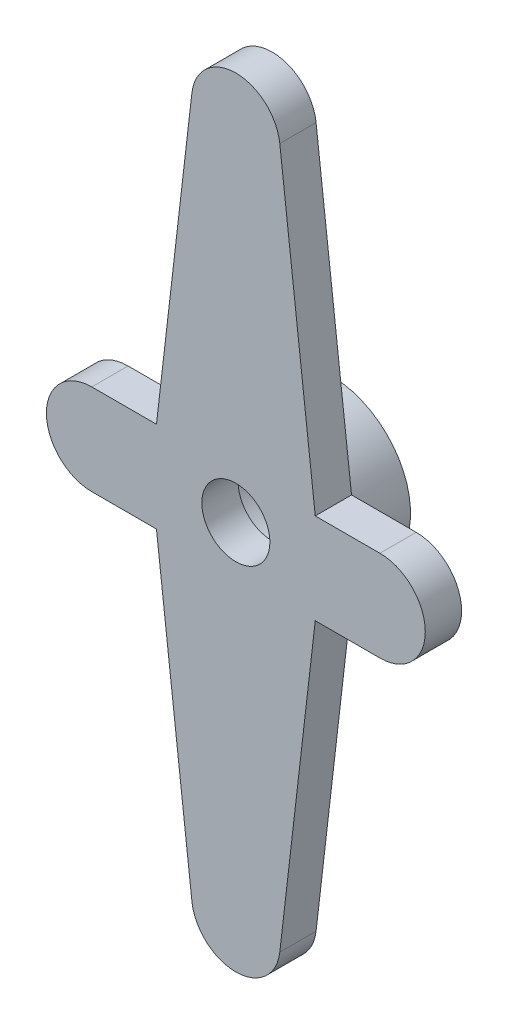
ISO-10303-21;
HEADER;
FILE_DESCRIPTION(('STEP AP214'),'2;1');
FILE_NAME('part.step','',(''),(''),'','','');
FILE_SCHEMA(('AUTOMOTIVE_DESIGN { 1 0 10303 214 1 1 1 1 }'));
ENDSEC;
DATA;
#1=APPLICATION_CONTEXT('core data for automotive mechanical design processes');
#2=APPLICATION_PROTOCOL_DEFINITION('international standard','automotive_design',2000,#1);
#3=PRODUCT_CONTEXT('',#1,'mechanical');
#4=PRODUCT('Part','Part','',(#3));
#5=PRODUCT_RELATED_PRODUCT_CATEGORY('part','',(#4));
#6=PRODUCT_DEFINITION_FORMATION('','',#4);
#7=PRODUCT_DEFINITION_CONTEXT('part definition',#1,'design');
#8=PRODUCT_DEFINITION('design','',#6,#7);
#9=PRODUCT_DEFINITION_SHAPE('','',#8);
#10=(LENGTH_UNIT() NAMED_UNIT(*) SI_UNIT(.MILLI.,.METRE.));
#11=(NAMED_UNIT(*) PLANE_ANGLE_UNIT() SI_UNIT($,.RADIAN.));
#12=(NAMED_UNIT(*) SI_UNIT($,.STERADIAN.) SOLID_ANGLE_UNIT());
#13=UNCERTAINTY_MEASURE_WITH_UNIT(LENGTH_MEASURE(1.E-05),#10,'distance_accuracy_value','');
#14=(GEOMETRIC_REPRESENTATION_CONTEXT(3) GLOBAL_UNCERTAINTY_ASSIGNED_CONTEXT((#13)) GLOBAL_UNIT_ASSIGNED_CONTEXT((#10,
#11,#12)) REPRESENTATION_CONTEXT('',''));
#15=CARTESIAN_POINT('',(0.,0.,0.));
#16=DIRECTION('',(0.,0.,1.));
#17=DIRECTION('',(1.,0.,0.));
#18=AXIS2_PLACEMENT_3D('',#15,#16,#17);
#19=CARTESIAN_POINT('',(-6.349999999074,5.05012435482173,1.6));
#20=DIRECTION('',(0.,0.,-1.));
#21=DIRECTION('',(-1.,0.,0.));
#22=AXIS2_PLACEMENT_3D('',#19,#20,#21);
#23=CYLINDRICAL_SURFACE('',#22,2.);
#24=CARTESIAN_POINT('',(-6.349999999074,5.05012435482173,0.));
#25=DIRECTION('',(0.,0.,1.));
#26=DIRECTION('',(1.,0.,0.));
#27=AXIS2_PLACEMENT_3D('',#24,#25,#26);
#28=CIRCLE('',#27,2.);
#29=CARTESIAN_POINT('',(-6.349999999074,7.05012435482173,0.));
#30=VERTEX_POINT('',#29);
#31=CARTESIAN_POINT('',(-6.349999999074,3.05012435482173,0.));
#32=VERTEX_POINT('',#31);
#33=EDGE_CURVE('E161',#30,#32,#28,.T.);
#34=ORIENTED_EDGE('',*,*,#33,.T.);
#35=DIRECTION('',(0.,0.,-1.));
#36=VECTOR('',#35,1.);
#37=CARTESIAN_POINT('',(-6.349999999074,3.05012435482173,1.6));
#38=LINE('',#37,#36);
#39=CARTESIAN_POINT('',(-6.349999999074,3.05012435482173,1.6));
#40=VERTEX_POINT('',#39);
#41=EDGE_CURVE('E47',#40,#32,#38,.T.);
#42=ORIENTED_EDGE('',*,*,#41,.F.);
#43=CARTESIAN_POINT('',(-6.349999999074,5.05012435482173,1.6));
#44=DIRECTION('',(0.,0.,1.));
#45=DIRECTION('',(1.,0.,0.));
#46=AXIS2_PLACEMENT_3D('',#43,#44,#45);
#47=CIRCLE('',#46,2.);
#48=CARTESIAN_POINT('',(-6.349999999074,7.05012435482173,1.6));
#49=VERTEX_POINT('',#48);
#50=EDGE_CURVE('E184',#49,#40,#47,.T.);
#51=ORIENTED_EDGE('',*,*,#50,.F.);
#52=DIRECTION('',(0.,0.,-1.));
#53=VECTOR('',#52,1.);
#54=CARTESIAN_POINT('',(-6.349999999074,7.05012435482173,1.6));
#55=LINE('',#54,#53);
#56=EDGE_CURVE('E157',#49,#30,#55,.T.);
#57=ORIENTED_EDGE('',*,*,#56,.T.);
#58=EDGE_LOOP('',(#34,#42,#51,#57));
#59=FACE_BOUND('',#58,.T.);
#60=ADVANCED_FACE('F38',(#59),#23,.T.);
#61=CARTESIAN_POINT('',(-6.349999999074,3.05012435482173,1.6));
#62=DIRECTION('',(0.,1.,0.));
#63=DIRECTION('',(-1.,0.,0.));
#64=AXIS2_PLACEMENT_3D('',#61,#62,#63);
#65=PLANE('',#64);
#66=DIRECTION('',(1.,0.,0.));
#67=VECTOR('',#66,1.);
#68=CARTESIAN_POINT('',(-6.349999999074,3.05012435482173,0.));
#69=LINE('',#68,#67);
#70=CARTESIAN_POINT('',(-3.5,3.05012435482173,0.));
#71=VERTEX_POINT('',#70);
#72=EDGE_CURVE('E164',#32,#71,#69,.T.);
#73=ORIENTED_EDGE('',*,*,#72,.T.);
#74=DIRECTION('',(0.,0.,-1.));
#75=VECTOR('',#74,1.);
#76=CARTESIAN_POINT('',(-3.5,3.05012435482173,1.6));
#77=LINE('',#76,#75);
#78=CARTESIAN_POINT('',(-3.5,3.05012435482173,1.6));
#79=VERTEX_POINT('',#78);
#80=EDGE_CURVE('E206',#79,#71,#77,.T.);
#81=ORIENTED_EDGE('',*,*,#80,.F.);
#82=DIRECTION('',(1.,0.,0.));
#83=VECTOR('',#82,1.);
#84=CARTESIAN_POINT('',(-6.349999999074,3.05012435482173,1.6));
#85=LINE('',#84,#83);
#86=EDGE_CURVE('E112',#40,#79,#85,.T.);
#87=ORIENTED_EDGE('',*,*,#86,.F.);
#88=ORIENTED_EDGE('',*,*,#41,.T.);
#89=EDGE_LOOP('',(#73,#81,#87,#88));
#90=FACE_BOUND('',#89,.T.);
#91=ADVANCED_FACE('F209',(#90),#65,.F.);
#92=CARTESIAN_POINT('',(-3.5,3.05012435482173,1.6));
#93=DIRECTION('',(0.993300343280583,0.115561360491629,0.));
#94=DIRECTION('',(-0.115561360491629,0.993300343280583,0.));
#95=AXIS2_PLACEMENT_3D('',#92,#93,#94);
#96=PLANE('',#95);
#97=DIRECTION('',(0.115561360491629,-0.993300343280583,0.));
#98=VECTOR('',#97,1.);
#99=CARTESIAN_POINT('',(-3.5,3.05012435482173,0.));
#100=LINE('',#99,#98);
#101=CARTESIAN_POINT('',(-1.93693566939714,-10.3850959433152,0.));
#102=VERTEX_POINT('',#101);
#103=EDGE_CURVE('E167',#71,#102,#100,.T.);
#104=ORIENTED_EDGE('',*,*,#103,.T.);
#105=DIRECTION('',(0.,0.,-1.));
#106=VECTOR('',#105,1.);
#107=CARTESIAN_POINT('',(-1.93693566939714,-10.3850959433152,1.6));
#108=LINE('',#107,#106);
#109=CARTESIAN_POINT('',(-1.93693566939714,-10.3850959433152,1.6));
#110=VERTEX_POINT('',#109);
#111=EDGE_CURVE('E203',#110,#102,#108,.T.);
#112=ORIENTED_EDGE('',*,*,#111,.F.);
#113=DIRECTION('',(0.115561360491629,-0.993300343280583,0.));
#114=VECTOR('',#113,1.);
#115=CARTESIAN_POINT('',(-3.5,3.05012435482173,1.6));
#116=LINE('',#115,#114);
#117=EDGE_CURVE('E229',#79,#110,#116,.T.);
#118=ORIENTED_EDGE('',*,*,#117,.F.);
#119=ORIENTED_EDGE('',*,*,#80,.T.);
#120=EDGE_LOOP('',(#104,#112,#118,#119));
#121=FACE_BOUND('',#120,.T.);
#122=ADVANCED_FACE('F220',(#121),#96,.F.);
#123=CARTESIAN_POINT('',(0.,-10.1597512903565,1.6));
#124=DIRECTION('',(0.,0.,-1.));
#125=DIRECTION('',(-1.,0.,0.));
#126=AXIS2_PLACEMENT_3D('',#123,#124,#125);
#127=CYLINDRICAL_SURFACE('',#126,1.95);
#128=CARTESIAN_POINT('',(0.,-10.1597512903565,0.));
#129=DIRECTION('',(0.,0.,1.));
#130=DIRECTION('',(-1.,0.,0.));
#131=AXIS2_PLACEMENT_3D('',#128,#129,#130);
#132=CIRCLE('',#131,1.95);
#133=CARTESIAN_POINT('',(1.93693566939714,-10.3850959433152,0.));
#134=VERTEX_POINT('',#133);
#135=EDGE_CURVE('E169',#102,#134,#132,.T.);
#136=ORIENTED_EDGE('',*,*,#135,.T.);
#137=DIRECTION('',(0.,0.,-1.));
#138=VECTOR('',#137,1.);
#139=CARTESIAN_POINT('',(1.93693566939714,-10.3850959433152,1.6));
#140=LINE('',#139,#138);
#141=CARTESIAN_POINT('',(1.93693566939714,-10.3850959433152,1.6));
#142=VERTEX_POINT('',#141);
#143=EDGE_CURVE('E200',#142,#134,#140,.T.);
#144=ORIENTED_EDGE('',*,*,#143,.F.);
#145=CARTESIAN_POINT('',(0.,-10.1597512903565,1.6));
#146=DIRECTION('',(0.,0.,1.));
#147=DIRECTION('',(-1.,0.,0.));
#148=AXIS2_PLACEMENT_3D('',#145,#146,#147);
#149=CIRCLE('',#148,1.95);
#150=EDGE_CURVE('E226',#110,#142,#149,.T.);
#151=ORIENTED_EDGE('',*,*,#150,.F.);
#152=ORIENTED_EDGE('',*,*,#111,.T.);
#153=EDGE_LOOP('',(#136,#144,#151,#152));
#154=FACE_BOUND('',#153,.T.);
#155=ADVANCED_FACE('F224',(#154),#127,.T.);
#156=CARTESIAN_POINT('',(3.5,3.05012435482173,1.6));
#157=DIRECTION('',(-0.993300343280583,0.115561360491629,0.));
#158=DIRECTION('',(-0.115561360491629,-0.993300343280583,0.));
#159=AXIS2_PLACEMENT_3D('',#156,#157,#158);
#160=PLANE('',#159);
#161=DIRECTION('',(0.115561360491629,0.993300343280583,0.));
#162=VECTOR('',#161,1.);
#163=CARTESIAN_POINT('',(3.5,3.05012435482173,0.));
#164=LINE('',#163,#162);
#165=CARTESIAN_POINT('',(3.5,3.05012435482173,0.));
#166=VERTEX_POINT('',#165);
#167=EDGE_CURVE('E171',#134,#166,#164,.T.);
#168=ORIENTED_EDGE('',*,*,#167,.T.);
#169=DIRECTION('',(0.,0.,-1.));
#170=VECTOR('',#169,1.);
#171=CARTESIAN_POINT('',(3.5,3.05012435482173,1.6));
#172=LINE('',#171,#170);
#173=CARTESIAN_POINT('',(3.5,3.05012435482173,1.6));
#174=VERTEX_POINT('',#173);
#175=EDGE_CURVE('E197',#174,#166,#172,.T.);
#176=ORIENTED_EDGE('',*,*,#175,.F.);
#177=DIRECTION('',(0.115561360491629,0.993300343280583,0.));
#178=VECTOR('',#177,1.);
#179=CARTESIAN_POINT('',(3.5,3.05012435482173,1.6));
#180=LINE('',#179,#178);
#181=EDGE_CURVE('E228',#142,#174,#180,.T.);
#182=ORIENTED_EDGE('',*,*,#181,.F.);
#183=ORIENTED_EDGE('',*,*,#143,.T.);
#184=EDGE_LOOP('',(#168,#176,#182,#183));
#185=FACE_BOUND('',#184,.T.);
#186=ADVANCED_FACE('F260',(#185),#160,.F.);
#187=CARTESIAN_POINT('',(6.349999999074,3.05012435482173,1.6));
#188=DIRECTION('',(0.,1.,0.));
#189=DIRECTION('',(-1.,0.,0.));
#190=AXIS2_PLACEMENT_3D('',#187,#188,#189);
#191=PLANE('',#190);
#192=DIRECTION('',(1.,0.,0.));
#193=VECTOR('',#192,1.);
#194=CARTESIAN_POINT('',(6.349999999074,3.05012435482173,0.));
#195=LINE('',#194,#193);
#196=CARTESIAN_POINT('',(6.349999999074,3.05012435482173,0.));
#197=VERTEX_POINT('',#196);
#198=EDGE_CURVE('E173',#166,#197,#195,.T.);
#199=ORIENTED_EDGE('',*,*,#198,.T.);
#200=DIRECTION('',(0.,0.,-1.));
#201=VECTOR('',#200,1.);
#202=CARTESIAN_POINT('',(6.349999999074,3.05012435482173,1.6));
#203=LINE('',#202,#201);
#204=CARTESIAN_POINT('',(6.349999999074,3.05012435482173,1.6));
#205=VERTEX_POINT('',#204);
#206=EDGE_CURVE('E194',#205,#197,#203,.T.);
#207=ORIENTED_EDGE('',*,*,#206,.F.);
#208=DIRECTION('',(1.,0.,0.));
#209=VECTOR('',#208,1.);
#210=CARTESIAN_POINT('',(6.349999999074,3.05012435482173,1.6));
#211=LINE('',#210,#209);
#212=EDGE_CURVE('E231',#174,#205,#211,.T.);
#213=ORIENTED_EDGE('',*,*,#212,.F.);
#214=ORIENTED_EDGE('',*,*,#175,.T.);
#215=EDGE_LOOP('',(#199,#207,#213,#214));
#216=FACE_BOUND('',#215,.T.);
#217=ADVANCED_FACE('F257',(#216),#191,.F.);
#218=CARTESIAN_POINT('',(6.349999999074,5.05012435482173,1.6));
#219=DIRECTION('',(0.,0.,-1.));
#220=DIRECTION('',(-1.,0.,0.));
#221=AXIS2_PLACEMENT_3D('',#218,#219,#220);
#222=CYLINDRICAL_SURFACE('',#221,2.);
#223=CARTESIAN_POINT('',(6.349999999074,5.05012435482173,0.));
#224=DIRECTION('',(0.,0.,1.));
#225=DIRECTION('',(-1.,0.,0.));
#226=AXIS2_PLACEMENT_3D('',#223,#224,#225);
#227=CIRCLE('',#226,2.);
#228=CARTESIAN_POINT('',(6.349999999074,7.05012435482173,0.));
#229=VERTEX_POINT('',#228);
#230=EDGE_CURVE('E175',#197,#229,#227,.T.);
#231=ORIENTED_EDGE('',*,*,#230,.T.);
#232=DIRECTION('',(0.,0.,-1.));
#233=VECTOR('',#232,1.);
#234=CARTESIAN_POINT('',(6.349999999074,7.05012435482173,1.6));
#235=LINE('',#234,#233);
#236=CARTESIAN_POINT('',(6.349999999074,7.05012435482173,1.6));
#237=VERTEX_POINT('',#236);
#238=EDGE_CURVE('E191',#237,#229,#235,.T.);
#239=ORIENTED_EDGE('',*,*,#238,.F.);
#240=CARTESIAN_POINT('',(6.349999999074,5.05012435482173,1.6));
#241=DIRECTION('',(0.,0.,1.));
#242=DIRECTION('',(-1.,0.,0.));
#243=AXIS2_PLACEMENT_3D('',#240,#241,#242);
#244=CIRCLE('',#243,2.);
#245=EDGE_CURVE('E237',#205,#237,#244,.T.);
#246=ORIENTED_EDGE('',*,*,#245,.F.);
#247=ORIENTED_EDGE('',*,*,#206,.T.);
#248=EDGE_LOOP('',(#231,#239,#246,#247));
#249=FACE_BOUND('',#248,.T.);
#250=ADVANCED_FACE('F253',(#249),#222,.T.);
#251=CARTESIAN_POINT('',(6.349999999074,7.05012435482173,1.6));
#252=DIRECTION('',(0.,-1.,0.));
#253=DIRECTION('',(1.,0.,0.));
#254=AXIS2_PLACEMENT_3D('',#251,#252,#253);
#255=PLANE('',#254);
#256=DIRECTION('',(-1.,0.,0.));
#257=VECTOR('',#256,1.);
#258=CARTESIAN_POINT('',(6.349999999074,7.05012435482173,0.));
#259=LINE('',#258,#257);
#260=CARTESIAN_POINT('',(3.5,7.05012435482173,0.));
#261=VERTEX_POINT('',#260);
#262=EDGE_CURVE('E177',#229,#261,#259,.T.);
#263=ORIENTED_EDGE('',*,*,#262,.T.);
#264=DIRECTION('',(0.,0.,-1.));
#265=VECTOR('',#264,1.);
#266=CARTESIAN_POINT('',(3.5,7.05012435482173,1.6));
#267=LINE('',#266,#265);
#268=CARTESIAN_POINT('',(3.5,7.05012435482173,1.6));
#269=VERTEX_POINT('',#268);
#270=EDGE_CURVE('E188',#269,#261,#267,.T.);
#271=ORIENTED_EDGE('',*,*,#270,.F.);
#272=DIRECTION('',(-1.,0.,0.));
#273=VECTOR('',#272,1.);
#274=CARTESIAN_POINT('',(6.349999999074,7.05012435482173,1.6));
#275=LINE('',#274,#273);
#276=EDGE_CURVE('E239',#237,#269,#275,.T.);
#277=ORIENTED_EDGE('',*,*,#276,.F.);
#278=ORIENTED_EDGE('',*,*,#238,.T.);
#279=EDGE_LOOP('',(#263,#271,#277,#278));
#280=FACE_BOUND('',#279,.T.);
#281=ADVANCED_FACE('F245',(#280),#255,.F.);
#282=CARTESIAN_POINT('',(3.5,7.05012435482173,1.6));
#283=DIRECTION('',(-0.993300343280583,-0.115561360491629,0.));
#284=DIRECTION('',(0.115561360491629,-0.993300343280583,0.));
#285=AXIS2_PLACEMENT_3D('',#282,#283,#284);
#286=PLANE('',#285);
#287=DIRECTION('',(-0.115561360491629,0.993300343280583,0.));
#288=VECTOR('',#287,1.);
#289=CARTESIAN_POINT('',(3.5,7.05012435482173,0.));
#290=LINE('',#289,#288);
#291=CARTESIAN_POINT('',(1.93693566939714,20.4853446529587,0.));
#292=VERTEX_POINT('',#291);
#293=EDGE_CURVE('E179',#261,#292,#290,.T.);
#294=ORIENTED_EDGE('',*,*,#293,.T.);
#295=DIRECTION('',(0.,0.,-1.));
#296=VECTOR('',#295,1.);
#297=CARTESIAN_POINT('',(1.93693566939714,20.4853446529587,1.6));
#298=LINE('',#297,#296);
#299=CARTESIAN_POINT('',(1.93693566939714,20.4853446529587,1.6));
#300=VERTEX_POINT('',#299);
#301=EDGE_CURVE('E152',#300,#292,#298,.T.);
#302=ORIENTED_EDGE('',*,*,#301,.F.);
#303=DIRECTION('',(-0.115561360491629,0.993300343280583,0.));
#304=VECTOR('',#303,1.);
#305=CARTESIAN_POINT('',(3.5,7.05012435482173,1.6));
#306=LINE('',#305,#304);
#307=EDGE_CURVE('E143',#269,#300,#306,.T.);
#308=ORIENTED_EDGE('',*,*,#307,.F.);
#309=ORIENTED_EDGE('',*,*,#270,.T.);
#310=EDGE_LOOP('',(#294,#302,#308,#309));
#311=FACE_BOUND('',#310,.T.);
#312=ADVANCED_FACE('F249',(#311),#286,.F.);
#313=CARTESIAN_POINT('',(0.,20.26,1.6));
#314=DIRECTION('',(0.,0.,-1.));
#315=DIRECTION('',(-1.,0.,0.));
#316=AXIS2_PLACEMENT_3D('',#313,#314,#315);
#317=CYLINDRICAL_SURFACE('',#316,1.95);
#318=CARTESIAN_POINT('',(0.,20.26,0.));
#319=DIRECTION('',(0.,0.,1.));
#320=DIRECTION('',(1.,0.,0.));
#321=AXIS2_PLACEMENT_3D('',#318,#319,#320);
#322=CIRCLE('',#321,1.95);
#323=CARTESIAN_POINT('',(-1.93693566939714,20.4853446529587,0.));
#324=VERTEX_POINT('',#323);
#325=EDGE_CURVE('E151',#292,#324,#322,.T.);
#326=ORIENTED_EDGE('',*,*,#325,.T.);
#327=DIRECTION('',(0.,0.,-1.));
#328=VECTOR('',#327,1.);
#329=CARTESIAN_POINT('',(-1.93693566939714,20.4853446529587,1.6));
#330=LINE('',#329,#328);
#331=CARTESIAN_POINT('',(-1.93693566939714,20.4853446529587,1.6));
#332=VERTEX_POINT('',#331);
#333=EDGE_CURVE('E148',#332,#324,#330,.T.);
#334=ORIENTED_EDGE('',*,*,#333,.F.);
#335=CARTESIAN_POINT('',(0.,20.26,1.6));
#336=DIRECTION('',(0.,0.,1.));
#337=DIRECTION('',(1.,0.,0.));
#338=AXIS2_PLACEMENT_3D('',#335,#336,#337);
#339=CIRCLE('',#338,1.95);
#340=EDGE_CURVE('E137',#300,#332,#339,.T.);
#341=ORIENTED_EDGE('',*,*,#340,.F.);
#342=ORIENTED_EDGE('',*,*,#301,.T.);
#343=EDGE_LOOP('',(#326,#334,#341,#342));
#344=FACE_BOUND('',#343,.T.);
#345=ADVANCED_FACE('F149',(#344),#317,.T.);
#346=CARTESIAN_POINT('',(-3.5,7.05012435482173,1.6));
#347=DIRECTION('',(0.993300343280583,-0.115561360491629,0.));
#348=DIRECTION('',(0.115561360491629,0.993300343280583,0.));
#349=AXIS2_PLACEMENT_3D('',#346,#347,#348);
#350=PLANE('',#349);
#351=DIRECTION('',(-0.115561360491629,-0.993300343280583,0.));
#352=VECTOR('',#351,1.);
#353=CARTESIAN_POINT('',(-3.5,7.05012435482173,0.));
#354=LINE('',#353,#352);
#355=CARTESIAN_POINT('',(-3.5,7.05012435482173,0.));
#356=VERTEX_POINT('',#355);
#357=EDGE_CURVE('E97',#324,#356,#354,.T.);
#358=ORIENTED_EDGE('',*,*,#357,.T.);
#359=DIRECTION('',(0.,0.,-1.));
#360=VECTOR('',#359,1.);
#361=CARTESIAN_POINT('',(-3.5,7.05012435482173,1.6));
#362=LINE('',#361,#360);
#363=CARTESIAN_POINT('',(-3.5,7.05012435482173,1.6));
#364=VERTEX_POINT('',#363);
#365=EDGE_CURVE('E153',#364,#356,#362,.T.);
#366=ORIENTED_EDGE('',*,*,#365,.F.);
#367=DIRECTION('',(-0.115561360491629,-0.993300343280583,0.));
#368=VECTOR('',#367,1.);
#369=CARTESIAN_POINT('',(-3.5,7.05012435482173,1.6));
#370=LINE('',#369,#368);
#371=EDGE_CURVE('E141',#332,#364,#370,.T.);
#372=ORIENTED_EDGE('',*,*,#371,.F.);
#373=ORIENTED_EDGE('',*,*,#333,.T.);
#374=EDGE_LOOP('',(#358,#366,#372,#373));
#375=FACE_BOUND('',#374,.T.);
#376=ADVANCED_FACE('F155',(#375),#350,.F.);
#377=CARTESIAN_POINT('',(-6.349999999074,7.05012435482173,1.6));
#378=DIRECTION('',(0.,-1.,0.));
#379=DIRECTION('',(1.,0.,0.));
#380=AXIS2_PLACEMENT_3D('',#377,#378,#379);
#381=PLANE('',#380);
#382=DIRECTION('',(-1.,0.,0.));
#383=VECTOR('',#382,1.);
#384=CARTESIAN_POINT('',(-6.349999999074,7.05012435482173,0.));
#385=LINE('',#384,#383);
#386=EDGE_CURVE('E103',#356,#30,#385,.T.);
#387=ORIENTED_EDGE('',*,*,#386,.T.);
#388=ORIENTED_EDGE('',*,*,#56,.F.);
#389=DIRECTION('',(-1.,0.,0.));
#390=VECTOR('',#389,1.);
#391=CARTESIAN_POINT('',(-6.349999999074,7.05012435482173,1.6));
#392=LINE('',#391,#390);
#393=EDGE_CURVE('E56',#364,#49,#392,.T.);
#394=ORIENTED_EDGE('',*,*,#393,.F.);
#395=ORIENTED_EDGE('',*,*,#365,.T.);
#396=EDGE_LOOP('',(#387,#388,#394,#395));
#397=FACE_BOUND('',#396,.T.);
#398=ADVANCED_FACE('F334',(#397),#381,.F.);
#399=CARTESIAN_POINT('',(-6.349999999074,5.05012435482173,1.6));
#400=DIRECTION('',(0.,0.,1.));
#401=DIRECTION('',(1.,0.,0.));
#402=AXIS2_PLACEMENT_3D('',#399,#400,#401);
#403=PLANE('',#402);
#404=CARTESIAN_POINT('',(0.,5.04999999999999,1.6));
#405=DIRECTION('',(0.,0.,1.));
#406=DIRECTION('',(1.,0.,0.));
#407=AXIS2_PLACEMENT_3D('',#404,#405,#406);
#408=CIRCLE('',#407,1.5);
#409=CARTESIAN_POINT('',(1.5,5.04999999999999,1.6));
#410=VERTEX_POINT('',#409);
#411=EDGE_CURVE('E41',#410,#410,#408,.T.);
#412=ORIENTED_EDGE('',*,*,#411,.F.);
#413=EDGE_LOOP('',(#412));
#414=FACE_BOUND('',#413,.T.);
#415=ORIENTED_EDGE('',*,*,#50,.T.);
#416=ORIENTED_EDGE('',*,*,#86,.T.);
#417=ORIENTED_EDGE('',*,*,#117,.T.);
#418=ORIENTED_EDGE('',*,*,#150,.T.);
#419=ORIENTED_EDGE('',*,*,#181,.T.);
#420=ORIENTED_EDGE('',*,*,#212,.T.);
#421=ORIENTED_EDGE('',*,*,#245,.T.);
#422=ORIENTED_EDGE('',*,*,#276,.T.);
#423=ORIENTED_EDGE('',*,*,#307,.T.);
#424=ORIENTED_EDGE('',*,*,#340,.T.);
#425=ORIENTED_EDGE('',*,*,#371,.T.);
#426=ORIENTED_EDGE('',*,*,#393,.T.);
#427=EDGE_LOOP('',(#415,#416,#417,#418,#419,#420,#421,#422,#423,#424,#425,#426));
#428=FACE_BOUND('',#427,.T.);
#429=ADVANCED_FACE('F139',(#414,#428),#403,.T.);
#430=CARTESIAN_POINT('',(-6.349999999074,5.05012435482173,0.));
#431=DIRECTION('',(0.,0.,1.));
#432=DIRECTION('',(1.,0.,0.));
#433=AXIS2_PLACEMENT_3D('',#430,#431,#432);
#434=PLANE('',#433);
#435=CARTESIAN_POINT('',(0.,5.04999999999999,0.));
#436=DIRECTION('',(0.,0.,-1.));
#437=DIRECTION('',(-1.,0.,0.));
#438=AXIS2_PLACEMENT_3D('',#435,#436,#437);
#439=CIRCLE('',#438,3.5);
#440=CARTESIAN_POINT('',(-3.5,5.04999999999999,0.));
#441=VERTEX_POINT('',#440);
#442=EDGE_CURVE('E11',#441,#441,#439,.T.);
#443=ORIENTED_EDGE('',*,*,#442,.F.);
#444=EDGE_LOOP('',(#443));
#445=FACE_BOUND('',#444,.T.);
#446=ORIENTED_EDGE('',*,*,#33,.F.);
#447=ORIENTED_EDGE('',*,*,#386,.F.);
#448=ORIENTED_EDGE('',*,*,#357,.F.);
#449=ORIENTED_EDGE('',*,*,#325,.F.);
#450=ORIENTED_EDGE('',*,*,#293,.F.);
#451=ORIENTED_EDGE('',*,*,#262,.F.);
#452=ORIENTED_EDGE('',*,*,#230,.F.);
#453=ORIENTED_EDGE('',*,*,#198,.F.);
#454=ORIENTED_EDGE('',*,*,#167,.F.);
#455=ORIENTED_EDGE('',*,*,#135,.F.);
#456=ORIENTED_EDGE('',*,*,#103,.F.);
#457=ORIENTED_EDGE('',*,*,#72,.F.);
#458=EDGE_LOOP('',(#446,#447,#448,#449,#450,#451,#452,#453,#454,#455,#456,#457));
#459=FACE_BOUND('',#458,.T.);
#460=ADVANCED_FACE('F214',(#445,#459),#434,.F.);
#461=CARTESIAN_POINT('',(0.,5.04999999999999,-2.6));
#462=DIRECTION('',(0.,0.,-1.));
#463=DIRECTION('',(-1.,0.,0.));
#464=AXIS2_PLACEMENT_3D('',#461,#462,#463);
#465=PLANE('',#464);
#466=CARTESIAN_POINT('',(0.,5.04999999999999,-2.6));
#467=DIRECTION('',(0.,0.,-1.));
#468=DIRECTION('',(-1.,0.,0.));
#469=AXIS2_PLACEMENT_3D('',#466,#467,#468);
#470=CIRCLE('',#469,3.5);
#471=CARTESIAN_POINT('',(-3.5,5.04999999999999,-2.6));
#472=VERTEX_POINT('',#471);
#473=EDGE_CURVE('E165',#472,#472,#470,.T.);
#474=ORIENTED_EDGE('',*,*,#473,.T.);
#475=EDGE_LOOP('',(#474));
#476=FACE_BOUND('',#475,.T.);
#477=CARTESIAN_POINT('',(0.,5.04999999999999,-2.6));
#478=DIRECTION('',(0.,0.,-1.));
#479=DIRECTION('',(-1.,0.,0.));
#480=AXIS2_PLACEMENT_3D('',#477,#478,#479);
#481=CIRCLE('',#480,2.5);
#482=CARTESIAN_POINT('',(-2.5,5.04999999999999,-2.6));
#483=VERTEX_POINT('',#482);
#484=EDGE_CURVE('E422',#483,#483,#481,.T.);
#485=ORIENTED_EDGE('',*,*,#484,.F.);
#486=EDGE_LOOP('',(#485));
#487=FACE_BOUND('',#486,.T.);
#488=ADVANCED_FACE('F353',(#476,#487),#465,.T.);
#489=CARTESIAN_POINT('',(0.,5.04999999999999,-2.6));
#490=DIRECTION('',(0.,0.,1.));
#491=DIRECTION('',(1.,0.,0.));
#492=AXIS2_PLACEMENT_3D('',#489,#490,#491);
#493=CYLINDRICAL_SURFACE('',#492,3.5);
#494=ORIENTED_EDGE('',*,*,#473,.F.);
#495=EDGE_LOOP('',(#494));
#496=FACE_BOUND('',#495,.T.);
#497=ORIENTED_EDGE('',*,*,#442,.T.);
#498=EDGE_LOOP('',(#497));
#499=FACE_BOUND('',#498,.T.);
#500=ADVANCED_FACE('F365',(#496,#499),#493,.T.);
#501=CARTESIAN_POINT('',(0.,5.04999999999999,-2.6));
#502=DIRECTION('',(0.,0.,1.));
#503=DIRECTION('',(1.,0.,0.));
#504=AXIS2_PLACEMENT_3D('',#501,#502,#503);
#505=CYLINDRICAL_SURFACE('',#504,2.5);
#506=ORIENTED_EDGE('',*,*,#484,.T.);
#507=EDGE_LOOP('',(#506));
#508=FACE_BOUND('',#507,.T.);
#509=CARTESIAN_POINT('',(0.,5.04999999999999,0.));
#510=DIRECTION('',(0.,0.,-1.));
#511=DIRECTION('',(-1.,0.,0.));
#512=AXIS2_PLACEMENT_3D('',#509,#510,#511);
#513=CIRCLE('',#512,2.5);
#514=CARTESIAN_POINT('',(-2.5,5.04999999999999,0.));
#515=VERTEX_POINT('',#514);
#516=EDGE_CURVE('E420',#515,#515,#513,.T.);
#517=ORIENTED_EDGE('',*,*,#516,.F.);
#518=EDGE_LOOP('',(#517));
#519=FACE_BOUND('',#518,.T.);
#520=ADVANCED_FACE('F375',(#508,#519),#505,.F.);
#521=CARTESIAN_POINT('',(0.,5.04999999999999,0.));
#522=DIRECTION('',(0.,0.,-1.));
#523=DIRECTION('',(-1.,0.,0.));
#524=AXIS2_PLACEMENT_3D('',#521,#522,#523);
#525=CIRCLE('',#524,1.5);
#526=CARTESIAN_POINT('',(-1.5,5.04999999999999,0.));
#527=VERTEX_POINT('',#526);
#528=EDGE_CURVE('E418',#527,#527,#525,.T.);
#529=ORIENTED_EDGE('',*,*,#528,.F.);
#530=EDGE_LOOP('',(#529));
#531=FACE_BOUND('',#530,.T.);
#532=ORIENTED_EDGE('',*,*,#516,.T.);
#533=EDGE_LOOP('',(#532));
#534=FACE_BOUND('',#533,.T.);
#535=ADVANCED_FACE('F356',(#531,#534),#434,.F.);
#536=CARTESIAN_POINT('',(0.,5.04999999999999,6.));
#537=DIRECTION('',(0.,0.,-1.));
#538=DIRECTION('',(-1.,0.,0.));
#539=AXIS2_PLACEMENT_3D('',#536,#537,#538);
#540=CYLINDRICAL_SURFACE('',#539,1.5);
#541=ORIENTED_EDGE('',*,*,#411,.T.);
#542=EDGE_LOOP('',(#541));
#543=FACE_BOUND('',#542,.T.);
#544=ORIENTED_EDGE('',*,*,#528,.T.);
#545=EDGE_LOOP('',(#544));
#546=FACE_BOUND('',#545,.T.);
#547=ADVANCED_FACE('F401',(#543,#546),#540,.F.);
#548=CLOSED_SHELL('',(#60,#91,#122,#155,#186,#217,#250,#281,#312,#345,#376,#398,#429,#460,#488,
#500,#520,#535,#547));
#549=MANIFOLD_SOLID_BREP('B2',#548);
#550=ADVANCED_BREP_SHAPE_REPRESENTATION('',(#18,#549),#14);
#551=SHAPE_DEFINITION_REPRESENTATION(#9,#550);
ENDSEC;
END-ISO-10303-21;
